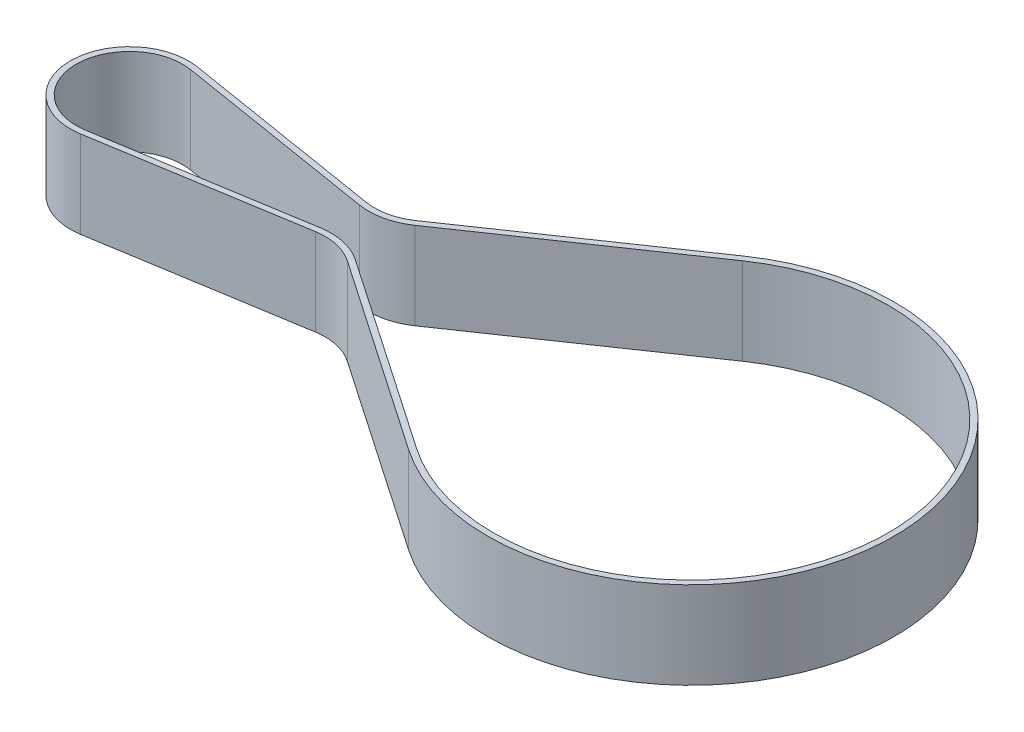
ISO-10303-21;
HEADER;
FILE_DESCRIPTION(('STEP AP214'),'2;1');
FILE_NAME('part.step','',(''),(''),'','','');
FILE_SCHEMA(('AUTOMOTIVE_DESIGN { 1 0 10303 214 1 1 1 1 }'));
ENDSEC;
DATA;
#1=APPLICATION_CONTEXT('core data for automotive mechanical design processes');
#2=APPLICATION_PROTOCOL_DEFINITION('international standard','automotive_design',2000,#1);
#3=PRODUCT_CONTEXT('',#1,'mechanical');
#4=PRODUCT('Part','Part','',(#3));
#5=PRODUCT_RELATED_PRODUCT_CATEGORY('part','',(#4));
#6=PRODUCT_DEFINITION_FORMATION('','',#4);
#7=PRODUCT_DEFINITION_CONTEXT('part definition',#1,'design');
#8=PRODUCT_DEFINITION('design','',#6,#7);
#9=PRODUCT_DEFINITION_SHAPE('','',#8);
#10=(LENGTH_UNIT() NAMED_UNIT(*) SI_UNIT(.MILLI.,.METRE.));
#11=(NAMED_UNIT(*) PLANE_ANGLE_UNIT() SI_UNIT($,.RADIAN.));
#12=(NAMED_UNIT(*) SI_UNIT($,.STERADIAN.) SOLID_ANGLE_UNIT());
#13=UNCERTAINTY_MEASURE_WITH_UNIT(LENGTH_MEASURE(1.E-05),#10,'distance_accuracy_value','');
#14=(GEOMETRIC_REPRESENTATION_CONTEXT(3) GLOBAL_UNCERTAINTY_ASSIGNED_CONTEXT((#13)) GLOBAL_UNIT_ASSIGNED_CONTEXT((#10,
#11,#12)) REPRESENTATION_CONTEXT('',''));
#15=CARTESIAN_POINT('',(0.,0.,0.));
#16=DIRECTION('',(0.,0.,1.));
#17=DIRECTION('',(1.,0.,0.));
#18=AXIS2_PLACEMENT_3D('',#15,#16,#17);
#19=CARTESIAN_POINT('',(33.4583151219955,15.,2.18112689427052));
#20=DIRECTION('',(0.,-1.,0.));
#21=DIRECTION('',(0.,0.,-1.));
#22=AXIS2_PLACEMENT_3D('',#19,#20,#21);
#23=CYLINDRICAL_SURFACE('',#22,34.);
#24=CARTESIAN_POINT('',(33.4583151219955,0.,2.18112689427052));
#25=DIRECTION('',(0.,1.,0.));
#26=DIRECTION('',(0.,0.,1.));
#27=AXIS2_PLACEMENT_3D('',#24,#25,#26);
#28=CIRCLE('',#27,34.);
#29=CARTESIAN_POINT('',(14.2553089623549,0.,30.2390055459577));
#30=VERTEX_POINT('',#29);
#31=CARTESIAN_POINT('',(14.2553056721387,0.,-25.8767495055697));
#32=VERTEX_POINT('',#31);
#33=EDGE_CURVE('E262',#30,#32,#28,.T.);
#34=ORIENTED_EDGE('',*,*,#33,.F.);
#35=DIRECTION('',(0.,-1.,0.));
#36=VECTOR('',#35,1.);
#37=CARTESIAN_POINT('',(14.2553089623549,15.,30.2390055459577));
#38=LINE('',#37,#36);
#39=CARTESIAN_POINT('',(14.2553089623549,15.,30.2390055459577));
#40=VERTEX_POINT('',#39);
#41=EDGE_CURVE('E11',#40,#30,#38,.T.);
#42=ORIENTED_EDGE('',*,*,#41,.F.);
#43=CARTESIAN_POINT('',(33.4583151219955,15.,2.18112689427052));
#44=DIRECTION('',(0.,1.,0.));
#45=DIRECTION('',(0.,0.,1.));
#46=AXIS2_PLACEMENT_3D('',#43,#44,#45);
#47=CIRCLE('',#46,34.);
#48=CARTESIAN_POINT('',(14.2553056721387,15.,-25.8767495055697));
#49=VERTEX_POINT('',#48);
#50=EDGE_CURVE('E310',#40,#49,#47,.T.);
#51=ORIENTED_EDGE('',*,*,#50,.T.);
#52=DIRECTION('',(0.,-1.,0.));
#53=VECTOR('',#52,1.);
#54=CARTESIAN_POINT('',(14.2553056721387,15.,-25.8767495055697));
#55=LINE('',#54,#53);
#56=EDGE_CURVE('E63',#49,#32,#55,.T.);
#57=ORIENTED_EDGE('',*,*,#56,.T.);
#58=EDGE_LOOP('',(#34,#42,#51,#57));
#59=FACE_BOUND('',#58,.T.);
#60=ADVANCED_FACE('F43',(#59),#23,.F.);
#61=CARTESIAN_POINT('',(-9.54664431629051,15.,13.9487841398636));
#62=DIRECTION('',(0.56479429881296,0.,-0.825231725049623));
#63=DIRECTION('',(-0.825231725049623,0.,-0.56479429881296));
#64=AXIS2_PLACEMENT_3D('',#61,#62,#63);
#65=PLANE('',#64);
#66=DIRECTION('',(0.825231725049623,0.,0.56479429881296));
#67=VECTOR('',#66,1.);
#68=CARTESIAN_POINT('',(-9.54664431629051,0.,13.9487841398636));
#69=LINE('',#68,#67);
#70=CARTESIAN_POINT('',(-19.2468595232367,0.,7.30988977863126));
#71=VERTEX_POINT('',#70);
#72=EDGE_CURVE('E258',#71,#30,#69,.T.);
#73=ORIENTED_EDGE('',*,*,#72,.F.);
#74=DIRECTION('',(0.,-1.,0.));
#75=VECTOR('',#74,1.);
#76=CARTESIAN_POINT('',(-19.2468595232367,15.,7.30988977863126));
#77=LINE('',#76,#75);
#78=CARTESIAN_POINT('',(-19.2468595232367,15.,7.30988977863126));
#79=VERTEX_POINT('',#78);
#80=EDGE_CURVE('E54',#79,#71,#77,.T.);
#81=ORIENTED_EDGE('',*,*,#80,.F.);
#82=DIRECTION('',(0.825231725049623,0.,0.56479429881296));
#83=VECTOR('',#82,1.);
#84=CARTESIAN_POINT('',(-9.54664431629051,15.,13.9487841398636));
#85=LINE('',#84,#83);
#86=EDGE_CURVE('E306',#79,#40,#85,.T.);
#87=ORIENTED_EDGE('',*,*,#86,.T.);
#88=ORIENTED_EDGE('',*,*,#41,.T.);
#89=EDGE_LOOP('',(#73,#81,#87,#88));
#90=FACE_BOUND('',#89,.T.);
#91=ADVANCED_FACE('F378',(#90),#65,.T.);
#92=CARTESIAN_POINT('',(-25.3183955466847,15.,16.1811268942705));
#93=DIRECTION('',(0.,-1.,0.));
#94=DIRECTION('',(0.,0.,-1.));
#95=AXIS2_PLACEMENT_3D('',#92,#93,#94);
#96=CYLINDRICAL_SURFACE('',#95,10.7499952393442);
#97=CARTESIAN_POINT('',(-25.3183955466847,0.,16.1811268942705));
#98=DIRECTION('',(0.,1.,0.));
#99=DIRECTION('',(0.,0.,1.));
#100=AXIS2_PLACEMENT_3D('',#97,#98,#99);
#101=CIRCLE('',#100,10.7499952393442);
#102=CARTESIAN_POINT('',(-27.0443612089832,0.,5.57059249780913));
#103=VERTEX_POINT('',#102);
#104=EDGE_CURVE('E254',#71,#103,#101,.T.);
#105=ORIENTED_EDGE('',*,*,#104,.T.);
#106=DIRECTION('',(0.,-1.,0.));
#107=VECTOR('',#106,1.);
#108=CARTESIAN_POINT('',(-27.0443612089832,15.,5.57059249780913));
#109=LINE('',#108,#107);
#110=CARTESIAN_POINT('',(-27.0443612089832,15.,5.57059249780913));
#111=VERTEX_POINT('',#110);
#112=EDGE_CURVE('E201',#111,#103,#109,.T.);
#113=ORIENTED_EDGE('',*,*,#112,.F.);
#114=CARTESIAN_POINT('',(-25.3183955466847,15.,16.1811268942705));
#115=DIRECTION('',(0.,1.,0.));
#116=DIRECTION('',(0.,0.,1.));
#117=AXIS2_PLACEMENT_3D('',#114,#115,#116);
#118=CIRCLE('',#117,10.7499952393442);
#119=EDGE_CURVE('E303',#79,#111,#118,.T.);
#120=ORIENTED_EDGE('',*,*,#119,.F.);
#121=ORIENTED_EDGE('',*,*,#80,.T.);
#122=EDGE_LOOP('',(#105,#113,#120,#121));
#123=FACE_BOUND('',#122,.T.);
#124=ADVANCED_FACE('F383',(#123),#96,.T.);
#125=CARTESIAN_POINT('',(0.185636398444397,15.,1.14121702068305));
#126=DIRECTION('',(-0.16055501643215,0.,-0.987026892591317));
#127=DIRECTION('',(-0.987026892591317,0.,0.16055501643215));
#128=AXIS2_PLACEMENT_3D('',#125,#126,#127);
#129=PLANE('',#128);
#130=DIRECTION('',(0.987026892591317,0.,-0.16055501643215));
#131=VECTOR('',#130,1.);
#132=CARTESIAN_POINT('',(0.185636398444397,0.,1.14121702068305));
#133=LINE('',#132,#131);
#134=CARTESIAN_POINT('',(-61.8493953773217,0.,11.2321634993329));
#135=VERTEX_POINT('',#134);
#136=EDGE_CURVE('E250',#135,#103,#133,.T.);
#137=ORIENTED_EDGE('',*,*,#136,.F.);
#138=DIRECTION('',(0.,-1.,0.));
#139=VECTOR('',#138,1.);
#140=CARTESIAN_POINT('',(-61.8493953773217,15.,11.2321634993329));
#141=LINE('',#140,#139);
#142=CARTESIAN_POINT('',(-61.8493953773217,15.,11.2321634993329));
#143=VERTEX_POINT('',#142);
#144=EDGE_CURVE('E194',#143,#135,#141,.T.);
#145=ORIENTED_EDGE('',*,*,#144,.F.);
#146=DIRECTION('',(0.987026892591317,0.,-0.16055501643215));
#147=VECTOR('',#146,1.);
#148=CARTESIAN_POINT('',(0.185636398444397,15.,1.14121702068305));
#149=LINE('',#148,#147);
#150=EDGE_CURVE('E299',#143,#111,#149,.T.);
#151=ORIENTED_EDGE('',*,*,#150,.T.);
#152=ORIENTED_EDGE('',*,*,#112,.T.);
#153=EDGE_LOOP('',(#137,#145,#151,#152));
#154=FACE_BOUND('',#153,.T.);
#155=ADVANCED_FACE('F389',(#154),#129,.T.);
#156=CARTESIAN_POINT('',(-63.3216848780045,15.,2.18112689427052));
#157=DIRECTION('',(0.,-1.,0.));
#158=DIRECTION('',(0.,0.,-1.));
#159=AXIS2_PLACEMENT_3D('',#156,#157,#158);
#160=CYLINDRICAL_SURFACE('',#159,9.17);
#161=CARTESIAN_POINT('',(-63.3216848780045,0.,2.18112689427052));
#162=DIRECTION('',(0.,1.,0.));
#163=DIRECTION('',(0.,0.,1.));
#164=AXIS2_PLACEMENT_3D('',#161,#162,#163);
#165=CIRCLE('',#164,9.17);
#166=CARTESIAN_POINT('',(-61.8493941553756,0.,-6.86990951202356));
#167=VERTEX_POINT('',#166);
#168=EDGE_CURVE('E246',#167,#135,#165,.T.);
#169=ORIENTED_EDGE('',*,*,#168,.F.);
#170=DIRECTION('',(0.,-1.,0.));
#171=VECTOR('',#170,1.);
#172=CARTESIAN_POINT('',(-61.8493941553756,15.,-6.86990951202356));
#173=LINE('',#172,#171);
#174=CARTESIAN_POINT('',(-61.8493941553756,15.,-6.86990951202356));
#175=VERTEX_POINT('',#174);
#176=EDGE_CURVE('E190',#175,#167,#173,.T.);
#177=ORIENTED_EDGE('',*,*,#176,.F.);
#178=CARTESIAN_POINT('',(-63.3216848780045,15.,2.18112689427052));
#179=DIRECTION('',(0.,1.,0.));
#180=DIRECTION('',(0.,0.,1.));
#181=AXIS2_PLACEMENT_3D('',#178,#179,#180);
#182=CIRCLE('',#181,9.17);
#183=EDGE_CURVE('E182',#175,#143,#182,.T.);
#184=ORIENTED_EDGE('',*,*,#183,.T.);
#185=ORIENTED_EDGE('',*,*,#144,.T.);
#186=EDGE_LOOP('',(#169,#177,#184,#185));
#187=FACE_BOUND('',#186,.T.);
#188=ADVANCED_FACE('F393',(#187),#160,.F.);
#189=CARTESIAN_POINT('',(-0.505660969701052,15.,3.10859518141506));
#190=DIRECTION('',(0.1605551496869,0.,-0.987026870915386));
#191=DIRECTION('',(-0.987026870915386,0.,-0.1605551496869));
#192=AXIS2_PLACEMENT_3D('',#189,#190,#191);
#193=PLANE('',#192);
#194=DIRECTION('',(0.987026870915386,0.,0.1605551496869));
#195=VECTOR('',#194,1.);
#196=CARTESIAN_POINT('',(-0.505660969701052,0.,3.10859518141506));
#197=LINE('',#196,#195);
#198=CARTESIAN_POINT('',(-27.0443634058189,0.,-1.20833424338909));
#199=VERTEX_POINT('',#198);
#200=EDGE_CURVE('E188',#167,#199,#197,.T.);
#201=ORIENTED_EDGE('',*,*,#200,.T.);
#202=DIRECTION('',(0.,-1.,0.));
#203=VECTOR('',#202,1.);
#204=CARTESIAN_POINT('',(-27.0443634058189,15.,-1.20833424338909));
#205=LINE('',#204,#203);
#206=CARTESIAN_POINT('',(-27.0443634058189,15.,-1.20833424338909));
#207=VERTEX_POINT('',#206);
#208=EDGE_CURVE('E168',#207,#199,#205,.T.);
#209=ORIENTED_EDGE('',*,*,#208,.F.);
#210=DIRECTION('',(0.987026870915386,0.,0.1605551496869));
#211=VECTOR('',#210,1.);
#212=CARTESIAN_POINT('',(-0.505660969701052,15.,3.10859518141506));
#213=LINE('',#212,#211);
#214=EDGE_CURVE('E174',#175,#207,#213,.T.);
#215=ORIENTED_EDGE('',*,*,#214,.F.);
#216=ORIENTED_EDGE('',*,*,#176,.T.);
#217=EDGE_LOOP('',(#201,#209,#215,#216));
#218=FACE_BOUND('',#217,.T.);
#219=ADVANCED_FACE('F186',(#218),#193,.F.);
#220=CARTESIAN_POINT('',(-25.3183955466847,15.,-11.8188731057295));
#221=DIRECTION('',(0.,-1.,0.));
#222=DIRECTION('',(0.,0.,-1.));
#223=AXIS2_PLACEMENT_3D('',#220,#221,#222);
#224=CYLINDRICAL_SURFACE('',#223,10.75);
#225=CARTESIAN_POINT('',(-25.3183955466847,0.,-11.8188731057295));
#226=DIRECTION('',(0.,1.,0.));
#227=DIRECTION('',(0.,0.,1.));
#228=AXIS2_PLACEMENT_3D('',#225,#226,#227);
#229=CIRCLE('',#228,10.75);
#230=CARTESIAN_POINT('',(-19.246855794156,0.,-2.94763277342737));
#231=VERTEX_POINT('',#230);
#232=EDGE_CURVE('E241',#199,#231,#229,.T.);
#233=ORIENTED_EDGE('',*,*,#232,.T.);
#234=DIRECTION('',(0.,-1.,0.));
#235=VECTOR('',#234,1.);
#236=CARTESIAN_POINT('',(-19.246855794156,15.,-2.94763277342737));
#237=LINE('',#236,#235);
#238=CARTESIAN_POINT('',(-19.246855794156,15.,-2.94763277342737));
#239=VERTEX_POINT('',#238);
#240=EDGE_CURVE('E113',#239,#231,#237,.T.);
#241=ORIENTED_EDGE('',*,*,#240,.F.);
#242=CARTESIAN_POINT('',(-25.3183955466847,15.,-11.8188731057295));
#243=DIRECTION('',(0.,1.,0.));
#244=DIRECTION('',(0.,0.,1.));
#245=AXIS2_PLACEMENT_3D('',#242,#243,#244);
#246=CIRCLE('',#245,10.75);
#247=EDGE_CURVE('E164',#207,#239,#246,.T.);
#248=ORIENTED_EDGE('',*,*,#247,.F.);
#249=ORIENTED_EDGE('',*,*,#208,.T.);
#250=EDGE_LOOP('',(#233,#241,#248,#249));
#251=FACE_BOUND('',#250,.T.);
#252=ADVANCED_FACE('F166',(#251),#224,.T.);
#253=CARTESIAN_POINT('',(-10.1114384373035,15.,14.7740118880467));
#254=DIRECTION('',(-0.564794395584021,0.,0.825231658818832));
#255=DIRECTION('',(0.825231658818832,0.,0.564794395584021));
#256=AXIS2_PLACEMENT_3D('',#253,#254,#255);
#257=PLANE('',#256);
#258=DIRECTION('',(-0.825231658818832,0.,-0.564794395584021));
#259=VECTOR('',#258,1.);
#260=CARTESIAN_POINT('',(-10.1114384373035,0.,14.7740118880467));
#261=LINE('',#260,#259);
#262=CARTESIAN_POINT('',(13.6905146635431,0.,31.0642372710057));
#263=VERTEX_POINT('',#262);
#264=CARTESIAN_POINT('',(-19.8116501897405,0.,8.13511822078692));
#265=VERTEX_POINT('',#264);
#266=EDGE_CURVE('E291',#263,#265,#261,.T.);
#267=ORIENTED_EDGE('',*,*,#266,.F.);
#268=DIRECTION('',(0.,-1.,0.));
#269=VECTOR('',#268,1.);
#270=CARTESIAN_POINT('',(13.6905146635431,15.,31.0642372710057));
#271=LINE('',#270,#269);
#272=CARTESIAN_POINT('',(13.6905146635431,15.,31.0642372710057));
#273=VERTEX_POINT('',#272);
#274=EDGE_CURVE('E47',#273,#263,#271,.T.);
#275=ORIENTED_EDGE('',*,*,#274,.F.);
#276=DIRECTION('',(-0.825231658818832,0.,-0.564794395584021));
#277=VECTOR('',#276,1.);
#278=CARTESIAN_POINT('',(-10.1114384373035,15.,14.7740118880467));
#279=LINE('',#278,#277);
#280=CARTESIAN_POINT('',(-19.8116501897405,15.,8.13511822078692));
#281=VERTEX_POINT('',#280);
#282=EDGE_CURVE('E240',#273,#281,#279,.T.);
#283=ORIENTED_EDGE('',*,*,#282,.T.);
#284=DIRECTION('',(0.,-1.,0.));
#285=VECTOR('',#284,1.);
#286=CARTESIAN_POINT('',(-19.8116501897405,15.,8.13511822078692));
#287=LINE('',#286,#285);
#288=EDGE_CURVE('E206',#281,#265,#287,.T.);
#289=ORIENTED_EDGE('',*,*,#288,.T.);
#290=EDGE_LOOP('',(#267,#275,#283,#289));
#291=FACE_BOUND('',#290,.T.);
#292=ADVANCED_FACE('F45',(#291),#257,.T.);
#293=CARTESIAN_POINT('',(33.4583151219955,15.,2.18112689427052));
#294=DIRECTION('',(0.,-1.,0.));
#295=DIRECTION('',(0.,0.,-1.));
#296=AXIS2_PLACEMENT_3D('',#293,#294,#295);
#297=CYLINDRICAL_SURFACE('',#296,35.);
#298=CARTESIAN_POINT('',(33.4583151219955,0.,2.18112689427052));
#299=DIRECTION('',(0.,1.,0.));
#300=DIRECTION('',(0.,0.,1.));
#301=AXIS2_PLACEMENT_3D('',#298,#299,#300);
#302=CIRCLE('',#301,35.);
#303=CARTESIAN_POINT('',(13.6905112765558,0.,-26.7019811643868));
#304=VERTEX_POINT('',#303);
#305=EDGE_CURVE('E288',#263,#304,#302,.T.);
#306=ORIENTED_EDGE('',*,*,#305,.T.);
#307=DIRECTION('',(0.,-1.,0.));
#308=VECTOR('',#307,1.);
#309=CARTESIAN_POINT('',(13.6905112765558,15.,-26.7019811643868));
#310=LINE('',#309,#308);
#311=CARTESIAN_POINT('',(13.6905112765558,15.,-26.7019811643868));
#312=VERTEX_POINT('',#311);
#313=EDGE_CURVE('E224',#312,#304,#310,.T.);
#314=ORIENTED_EDGE('',*,*,#313,.F.);
#315=CARTESIAN_POINT('',(33.4583151219955,15.,2.18112689427052));
#316=DIRECTION('',(0.,1.,0.));
#317=DIRECTION('',(0.,0.,1.));
#318=AXIS2_PLACEMENT_3D('',#315,#316,#317);
#319=CIRCLE('',#318,35.);
#320=EDGE_CURVE('E334',#273,#312,#319,.T.);
#321=ORIENTED_EDGE('',*,*,#320,.F.);
#322=ORIENTED_EDGE('',*,*,#274,.T.);
#323=EDGE_LOOP('',(#306,#314,#321,#322));
#324=FACE_BOUND('',#323,.T.);
#325=ADVANCED_FACE('F350',(#324),#297,.T.);
#326=CARTESIAN_POINT('',(-8.07825207594808,15.,-11.803285254093));
#327=DIRECTION('',(-0.564794395584025,0.,-0.825231658818829));
#328=DIRECTION('',(-0.825231658818829,0.,0.564794395584025));
#329=AXIS2_PLACEMENT_3D('',#326,#327,#328);
#330=PLANE('',#329);
#331=DIRECTION('',(0.825231658818829,0.,-0.564794395584025));
#332=VECTOR('',#331,1.);
#333=CARTESIAN_POINT('',(-8.07825207594808,0.,-11.803285254093));
#334=LINE('',#333,#332);
#335=CARTESIAN_POINT('',(-19.8116501897405,0.,-3.77286443224589));
#336=VERTEX_POINT('',#335);
#337=EDGE_CURVE('E284',#336,#304,#334,.T.);
#338=ORIENTED_EDGE('',*,*,#337,.F.);
#339=DIRECTION('',(0.,-1.,0.));
#340=VECTOR('',#339,1.);
#341=CARTESIAN_POINT('',(-19.8116501897405,15.,-3.77286443224589));
#342=LINE('',#341,#340);
#343=CARTESIAN_POINT('',(-19.8116501897405,15.,-3.77286443224589));
#344=VERTEX_POINT('',#343);
#345=EDGE_CURVE('E222',#344,#336,#342,.T.);
#346=ORIENTED_EDGE('',*,*,#345,.F.);
#347=DIRECTION('',(0.825231658818829,0.,-0.564794395584025));
#348=VECTOR('',#347,1.);
#349=CARTESIAN_POINT('',(-8.07825207594808,15.,-11.803285254093));
#350=LINE('',#349,#348);
#351=EDGE_CURVE('E331',#344,#312,#350,.T.);
#352=ORIENTED_EDGE('',*,*,#351,.T.);
#353=ORIENTED_EDGE('',*,*,#313,.T.);
#354=EDGE_LOOP('',(#338,#346,#352,#353));
#355=FACE_BOUND('',#354,.T.);
#356=ADVANCED_FACE('F352',(#355),#330,.T.);
#357=CARTESIAN_POINT('',(-25.3183955466847,15.,-11.8188731057295));
#358=DIRECTION('',(0.,-1.,0.));
#359=DIRECTION('',(0.,0.,-1.));
#360=AXIS2_PLACEMENT_3D('',#357,#358,#359);
#361=CYLINDRICAL_SURFACE('',#360,9.75);
#362=CARTESIAN_POINT('',(-25.3183955466847,0.,-11.8188731057295));
#363=DIRECTION('',(0.,1.,0.));
#364=DIRECTION('',(0.,0.,1.));
#365=AXIS2_PLACEMENT_3D('',#362,#363,#364);
#366=CIRCLE('',#365,9.75);
#367=CARTESIAN_POINT('',(-26.883808256132,0.,-2.19536111430447));
#368=VERTEX_POINT('',#367);
#369=EDGE_CURVE('E280',#368,#336,#366,.T.);
#370=ORIENTED_EDGE('',*,*,#369,.F.);
#371=DIRECTION('',(0.,-1.,0.));
#372=VECTOR('',#371,1.);
#373=CARTESIAN_POINT('',(-26.883808256132,15.,-2.19536111430447));
#374=LINE('',#373,#372);
#375=CARTESIAN_POINT('',(-26.883808256132,15.,-2.19536111430447));
#376=VERTEX_POINT('',#375);
#377=EDGE_CURVE('E219',#376,#368,#374,.T.);
#378=ORIENTED_EDGE('',*,*,#377,.F.);
#379=CARTESIAN_POINT('',(-25.3183955466847,15.,-11.8188731057295));
#380=DIRECTION('',(0.,1.,0.));
#381=DIRECTION('',(0.,0.,1.));
#382=AXIS2_PLACEMENT_3D('',#379,#380,#381);
#383=CIRCLE('',#382,9.75);
#384=EDGE_CURVE('E327',#376,#344,#383,.T.);
#385=ORIENTED_EDGE('',*,*,#384,.T.);
#386=ORIENTED_EDGE('',*,*,#345,.T.);
#387=EDGE_LOOP('',(#370,#378,#385,#386));
#388=FACE_BOUND('',#387,.T.);
#389=ADVANCED_FACE('F356',(#388),#361,.F.);
#390=CARTESIAN_POINT('',(-0.345105820014155,15.,2.12156831049968));
#391=DIRECTION('',(-0.1605551496869,0.,0.987026870915386));
#392=DIRECTION('',(0.987026870915386,0.,0.1605551496869));
#393=AXIS2_PLACEMENT_3D('',#390,#391,#392);
#394=PLANE('',#393);
#395=DIRECTION('',(-0.987026870915386,0.,-0.1605551496869));
#396=VECTOR('',#395,1.);
#397=CARTESIAN_POINT('',(-0.345105820014155,0.,2.12156831049968));
#398=LINE('',#397,#396);
#399=CARTESIAN_POINT('',(-61.6888390056887,0.,-7.85693638293895));
#400=VERTEX_POINT('',#399);
#401=EDGE_CURVE('E277',#368,#400,#398,.T.);
#402=ORIENTED_EDGE('',*,*,#401,.T.);
#403=DIRECTION('',(0.,-1.,0.));
#404=VECTOR('',#403,1.);
#405=CARTESIAN_POINT('',(-61.6888390056887,15.,-7.85693638293895));
#406=LINE('',#405,#404);
#407=CARTESIAN_POINT('',(-61.6888390056887,15.,-7.85693638293895));
#408=VERTEX_POINT('',#407);
#409=EDGE_CURVE('E215',#408,#400,#406,.T.);
#410=ORIENTED_EDGE('',*,*,#409,.F.);
#411=DIRECTION('',(-0.987026870915386,0.,-0.1605551496869));
#412=VECTOR('',#411,1.);
#413=CARTESIAN_POINT('',(-0.345105820014155,15.,2.12156831049968));
#414=LINE('',#413,#412);
#415=EDGE_CURVE('E324',#376,#408,#414,.T.);
#416=ORIENTED_EDGE('',*,*,#415,.F.);
#417=ORIENTED_EDGE('',*,*,#377,.T.);
#418=EDGE_LOOP('',(#402,#410,#416,#417));
#419=FACE_BOUND('',#418,.T.);
#420=ADVANCED_FACE('F361',(#419),#394,.F.);
#421=CARTESIAN_POINT('',(-63.3216848780045,15.,2.18112689427052));
#422=DIRECTION('',(0.,-1.,0.));
#423=DIRECTION('',(0.,0.,-1.));
#424=AXIS2_PLACEMENT_3D('',#421,#422,#423);
#425=CYLINDRICAL_SURFACE('',#424,10.17);
#426=CARTESIAN_POINT('',(-63.3216848780045,0.,2.18112689427052));
#427=DIRECTION('',(0.,1.,0.));
#428=DIRECTION('',(0.,0.,1.));
#429=AXIS2_PLACEMENT_3D('',#426,#427,#428);
#430=CIRCLE('',#429,10.17);
#431=CARTESIAN_POINT('',(-61.6888390056887,0.,12.21919017148));
#432=VERTEX_POINT('',#431);
#433=EDGE_CURVE('E273',#400,#432,#430,.T.);
#434=ORIENTED_EDGE('',*,*,#433,.T.);
#435=DIRECTION('',(0.,-1.,0.));
#436=VECTOR('',#435,1.);
#437=CARTESIAN_POINT('',(-61.6888390056887,15.,12.21919017148));
#438=LINE('',#437,#436);
#439=CARTESIAN_POINT('',(-61.6888390056887,15.,12.21919017148));
#440=VERTEX_POINT('',#439);
#441=EDGE_CURVE('E212',#440,#432,#438,.T.);
#442=ORIENTED_EDGE('',*,*,#441,.F.);
#443=CARTESIAN_POINT('',(-63.3216848780045,15.,2.18112689427052));
#444=DIRECTION('',(0.,1.,0.));
#445=DIRECTION('',(0.,0.,1.));
#446=AXIS2_PLACEMENT_3D('',#443,#444,#445);
#447=CIRCLE('',#446,10.17);
#448=EDGE_CURVE('E321',#408,#440,#447,.T.);
#449=ORIENTED_EDGE('',*,*,#448,.F.);
#450=ORIENTED_EDGE('',*,*,#409,.T.);
#451=EDGE_LOOP('',(#434,#442,#449,#450));
#452=FACE_BOUND('',#451,.T.);
#453=ADVANCED_FACE('F365',(#452),#425,.T.);
#454=CARTESIAN_POINT('',(0.346190339861202,15.,2.12823549142265));
#455=DIRECTION('',(0.160555149686899,0.,0.987026870915386));
#456=DIRECTION('',(0.987026870915386,0.,-0.160555149686899));
#457=AXIS2_PLACEMENT_3D('',#454,#455,#456);
#458=PLANE('',#457);
#459=DIRECTION('',(-0.987026870915386,0.,0.160555149686899));
#460=VECTOR('',#459,1.);
#461=CARTESIAN_POINT('',(0.346190339861202,0.,2.12823549142265));
#462=LINE('',#461,#460);
#463=CARTESIAN_POINT('',(-26.883808256132,0.,6.55761490284552));
#464=VERTEX_POINT('',#463);
#465=EDGE_CURVE('E269',#464,#432,#462,.T.);
#466=ORIENTED_EDGE('',*,*,#465,.F.);
#467=DIRECTION('',(0.,-1.,0.));
#468=VECTOR('',#467,1.);
#469=CARTESIAN_POINT('',(-26.883808256132,15.,6.55761490284552));
#470=LINE('',#469,#468);
#471=CARTESIAN_POINT('',(-26.883808256132,15.,6.55761490284552));
#472=VERTEX_POINT('',#471);
#473=EDGE_CURVE('E209',#472,#464,#470,.T.);
#474=ORIENTED_EDGE('',*,*,#473,.F.);
#475=DIRECTION('',(-0.987026870915386,0.,0.160555149686899));
#476=VECTOR('',#475,1.);
#477=CARTESIAN_POINT('',(0.346190339861202,15.,2.12823549142265));
#478=LINE('',#477,#476);
#479=EDGE_CURVE('E317',#472,#440,#478,.T.);
#480=ORIENTED_EDGE('',*,*,#479,.T.);
#481=ORIENTED_EDGE('',*,*,#441,.T.);
#482=EDGE_LOOP('',(#466,#474,#480,#481));
#483=FACE_BOUND('',#482,.T.);
#484=ADVANCED_FACE('F367',(#483),#458,.T.);
#485=CARTESIAN_POINT('',(-25.3183955466847,15.,16.1811268942705));
#486=DIRECTION('',(0.,-1.,0.));
#487=DIRECTION('',(0.,0.,-1.));
#488=AXIS2_PLACEMENT_3D('',#485,#486,#487);
#489=CYLINDRICAL_SURFACE('',#488,9.74999999999999);
#490=CARTESIAN_POINT('',(-25.3183955466847,0.,16.1811268942705));
#491=DIRECTION('',(0.,1.,0.));
#492=DIRECTION('',(0.,0.,1.));
#493=AXIS2_PLACEMENT_3D('',#490,#491,#492);
#494=CIRCLE('',#493,9.74999999999999);
#495=EDGE_CURVE('E265',#265,#464,#494,.T.);
#496=ORIENTED_EDGE('',*,*,#495,.F.);
#497=ORIENTED_EDGE('',*,*,#288,.F.);
#498=CARTESIAN_POINT('',(-25.3183955466847,15.,16.1811268942705));
#499=DIRECTION('',(0.,1.,0.));
#500=DIRECTION('',(0.,0.,1.));
#501=AXIS2_PLACEMENT_3D('',#498,#499,#500);
#502=CIRCLE('',#501,9.74999999999999);
#503=EDGE_CURVE('E313',#281,#472,#502,.T.);
#504=ORIENTED_EDGE('',*,*,#503,.T.);
#505=ORIENTED_EDGE('',*,*,#473,.T.);
#506=EDGE_LOOP('',(#496,#497,#504,#505));
#507=FACE_BOUND('',#506,.T.);
#508=ADVANCED_FACE('F344',(#507),#489,.F.);
#509=CARTESIAN_POINT('',(-7.513457680365,15.,-10.9780535952743));
#510=DIRECTION('',(0.564794395584066,0.,0.825231658818801));
#511=DIRECTION('',(0.825231658818801,0.,-0.564794395584066));
#512=AXIS2_PLACEMENT_3D('',#509,#510,#511);
#513=PLANE('',#512);
#514=DIRECTION('',(-0.825231658818801,0.,0.564794395584066));
#515=VECTOR('',#514,1.);
#516=CARTESIAN_POINT('',(-7.513457680365,0.,-10.9780535952743));
#517=LINE('',#516,#515);
#518=EDGE_CURVE('E236',#32,#231,#517,.T.);
#519=ORIENTED_EDGE('',*,*,#518,.F.);
#520=ORIENTED_EDGE('',*,*,#56,.F.);
#521=DIRECTION('',(-0.825231658818801,0.,0.564794395584066));
#522=VECTOR('',#521,1.);
#523=CARTESIAN_POINT('',(-7.513457680365,15.,-10.9780535952743));
#524=LINE('',#523,#522);
#525=EDGE_CURVE('E173',#49,#239,#524,.T.);
#526=ORIENTED_EDGE('',*,*,#525,.T.);
#527=ORIENTED_EDGE('',*,*,#240,.T.);
#528=EDGE_LOOP('',(#519,#520,#526,#527));
#529=FACE_BOUND('',#528,.T.);
#530=ADVANCED_FACE('F374',(#529),#513,.T.);
#531=CARTESIAN_POINT('',(0.,15.,0.));
#532=DIRECTION('',(0.,1.,0.));
#533=DIRECTION('',(0.,0.,1.));
#534=AXIS2_PLACEMENT_3D('',#531,#532,#533);
#535=PLANE('',#534);
#536=ORIENTED_EDGE('',*,*,#282,.F.);
#537=ORIENTED_EDGE('',*,*,#320,.T.);
#538=ORIENTED_EDGE('',*,*,#351,.F.);
#539=ORIENTED_EDGE('',*,*,#384,.F.);
#540=ORIENTED_EDGE('',*,*,#415,.T.);
#541=ORIENTED_EDGE('',*,*,#448,.T.);
#542=ORIENTED_EDGE('',*,*,#479,.F.);
#543=ORIENTED_EDGE('',*,*,#503,.F.);
#544=EDGE_LOOP('',(#536,#537,#538,#539,#540,#541,#542,#543));
#545=FACE_BOUND('',#544,.T.);
#546=ORIENTED_EDGE('',*,*,#50,.F.);
#547=ORIENTED_EDGE('',*,*,#86,.F.);
#548=ORIENTED_EDGE('',*,*,#119,.T.);
#549=ORIENTED_EDGE('',*,*,#150,.F.);
#550=ORIENTED_EDGE('',*,*,#183,.F.);
#551=ORIENTED_EDGE('',*,*,#214,.T.);
#552=ORIENTED_EDGE('',*,*,#247,.T.);
#553=ORIENTED_EDGE('',*,*,#525,.F.);
#554=EDGE_LOOP('',(#546,#547,#548,#549,#550,#551,#552,#553));
#555=FACE_BOUND('',#554,.T.);
#556=ADVANCED_FACE('F179',(#545,#555),#535,.T.);
#557=CARTESIAN_POINT('',(0.,0.,0.));
#558=DIRECTION('',(0.,1.,0.));
#559=DIRECTION('',(0.,0.,1.));
#560=AXIS2_PLACEMENT_3D('',#557,#558,#559);
#561=PLANE('',#560);
#562=ORIENTED_EDGE('',*,*,#266,.T.);
#563=ORIENTED_EDGE('',*,*,#495,.T.);
#564=ORIENTED_EDGE('',*,*,#465,.T.);
#565=ORIENTED_EDGE('',*,*,#433,.F.);
#566=ORIENTED_EDGE('',*,*,#401,.F.);
#567=ORIENTED_EDGE('',*,*,#369,.T.);
#568=ORIENTED_EDGE('',*,*,#337,.T.);
#569=ORIENTED_EDGE('',*,*,#305,.F.);
#570=EDGE_LOOP('',(#562,#563,#564,#565,#566,#567,#568,#569));
#571=FACE_BOUND('',#570,.T.);
#572=ORIENTED_EDGE('',*,*,#33,.T.);
#573=ORIENTED_EDGE('',*,*,#518,.T.);
#574=ORIENTED_EDGE('',*,*,#232,.F.);
#575=ORIENTED_EDGE('',*,*,#200,.F.);
#576=ORIENTED_EDGE('',*,*,#168,.T.);
#577=ORIENTED_EDGE('',*,*,#136,.T.);
#578=ORIENTED_EDGE('',*,*,#104,.F.);
#579=ORIENTED_EDGE('',*,*,#72,.T.);
#580=EDGE_LOOP('',(#572,#573,#574,#575,#576,#577,#578,#579));
#581=FACE_BOUND('',#580,.T.);
#582=ADVANCED_FACE('F347',(#571,#581),#561,.F.);
#583=CLOSED_SHELL('',(#60,#91,#124,#155,#188,#219,#252,#292,#325,#356,#389,#420,#453,#484,#508,
#530,#556,#582));
#584=MANIFOLD_SOLID_BREP('B2',#583);
#585=ADVANCED_BREP_SHAPE_REPRESENTATION('',(#18,#584),#14);
#586=SHAPE_DEFINITION_REPRESENTATION(#9,#585);
ENDSEC;
END-ISO-10303-21;
